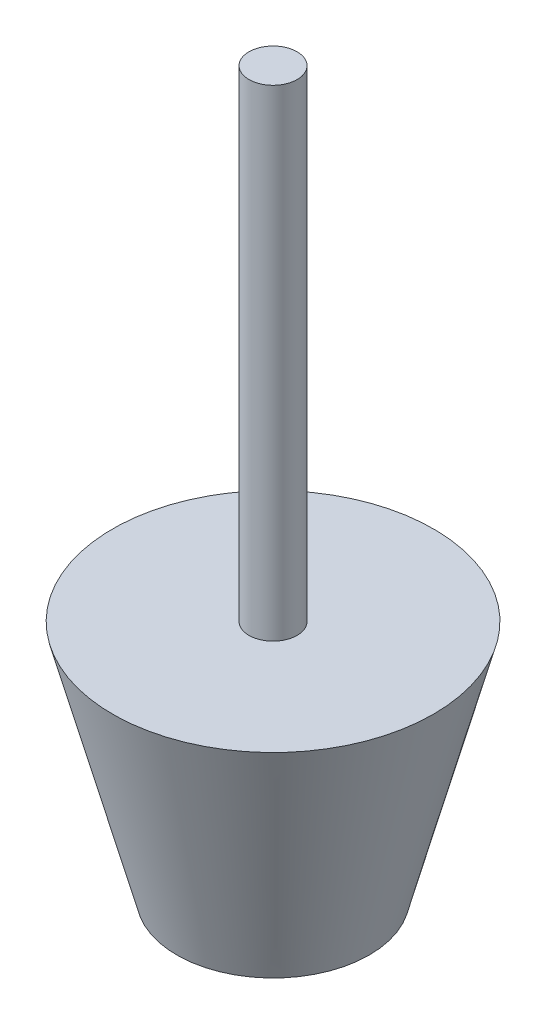
ISO-10303-21;
HEADER;
FILE_DESCRIPTION(('STEP AP214'),'2;1');
FILE_NAME('part.step','',(''),(''),'','','');
FILE_SCHEMA(('AUTOMOTIVE_DESIGN { 1 0 10303 214 1 1 1 1 }'));
ENDSEC;
DATA;
#1=APPLICATION_CONTEXT('core data for automotive mechanical design processes');
#2=APPLICATION_PROTOCOL_DEFINITION('international standard','automotive_design',2000,#1);
#3=PRODUCT_CONTEXT('',#1,'mechanical');
#4=PRODUCT('Part','Part','',(#3));
#5=PRODUCT_RELATED_PRODUCT_CATEGORY('part','',(#4));
#6=PRODUCT_DEFINITION_FORMATION('','',#4);
#7=PRODUCT_DEFINITION_CONTEXT('part definition',#1,'design');
#8=PRODUCT_DEFINITION('design','',#6,#7);
#9=PRODUCT_DEFINITION_SHAPE('','',#8);
#10=(LENGTH_UNIT() NAMED_UNIT(*) SI_UNIT(.MILLI.,.METRE.));
#11=(NAMED_UNIT(*) PLANE_ANGLE_UNIT() SI_UNIT($,.RADIAN.));
#12=(NAMED_UNIT(*) SI_UNIT($,.STERADIAN.) SOLID_ANGLE_UNIT());
#13=UNCERTAINTY_MEASURE_WITH_UNIT(LENGTH_MEASURE(1.E-05),#10,'distance_accuracy_value','');
#14=(GEOMETRIC_REPRESENTATION_CONTEXT(3) GLOBAL_UNCERTAINTY_ASSIGNED_CONTEXT((#13)) GLOBAL_UNIT_ASSIGNED_CONTEXT((#10,
#11,#12)) REPRESENTATION_CONTEXT('',''));
#15=CARTESIAN_POINT('',(0.,0.,0.));
#16=DIRECTION('',(0.,0.,1.));
#17=DIRECTION('',(1.,0.,0.));
#18=AXIS2_PLACEMENT_3D('',#15,#16,#17);
#19=CARTESIAN_POINT('',(0.,-30.,0.));
#20=DIRECTION('',(0.,-1.,0.));
#21=DIRECTION('',(1.,0.,0.));
#22=AXIS2_PLACEMENT_3D('',#19,#20,#21);
#23=CYLINDRICAL_SURFACE('',#22,1.5);
#24=CARTESIAN_POINT('',(0.,-15.,0.));
#25=DIRECTION('',(0.,-1.,0.));
#26=DIRECTION('',(1.,0.,0.));
#27=AXIS2_PLACEMENT_3D('',#24,#25,#26);
#28=CIRCLE('',#27,1.5);
#29=CARTESIAN_POINT('',(1.5,-15.,0.));
#30=VERTEX_POINT('',#29);
#31=EDGE_CURVE('E45',#30,#30,#28,.T.);
#32=ORIENTED_EDGE('',*,*,#31,.F.);
#33=EDGE_LOOP('',(#32));
#34=FACE_BOUND('',#33,.T.);
#35=CARTESIAN_POINT('',(0.,15.,0.));
#36=DIRECTION('',(0.,-1.,0.));
#37=DIRECTION('',(1.,0.,0.));
#38=AXIS2_PLACEMENT_3D('',#35,#36,#37);
#39=CIRCLE('',#38,1.50000000000001);
#40=CARTESIAN_POINT('',(1.50000000000001,15.,0.));
#41=VERTEX_POINT('',#40);
#42=EDGE_CURVE('E10',#41,#41,#39,.T.);
#43=ORIENTED_EDGE('',*,*,#42,.T.);
#44=EDGE_LOOP('',(#43));
#45=FACE_BOUND('',#44,.T.);
#46=ADVANCED_FACE('F31',(#34,#45),#23,.T.);
#47=CARTESIAN_POINT('',(-1.5,15.,0.));
#48=DIRECTION('',(0.,-1.,0.));
#49=DIRECTION('',(1.,0.,0.));
#50=AXIS2_PLACEMENT_3D('',#47,#48,#49);
#51=PLANE('',#50);
#52=ORIENTED_EDGE('',*,*,#42,.F.);
#53=EDGE_LOOP('',(#52));
#54=FACE_BOUND('',#53,.T.);
#55=ADVANCED_FACE('F54',(#54),#51,.F.);
#56=CARTESIAN_POINT('',(-6.,-30.,0.));
#57=DIRECTION('',(0.,1.,0.));
#58=DIRECTION('',(-1.,0.,0.));
#59=AXIS2_PLACEMENT_3D('',#56,#57,#58);
#60=PLANE('',#59);
#61=CARTESIAN_POINT('',(0.,-30.,0.));
#62=DIRECTION('',(0.,-1.,0.));
#63=DIRECTION('',(1.,0.,0.));
#64=AXIS2_PLACEMENT_3D('',#61,#62,#63);
#65=CIRCLE('',#64,6.);
#66=CARTESIAN_POINT('',(6.,-30.,0.));
#67=VERTEX_POINT('',#66);
#68=EDGE_CURVE('E37',#67,#67,#65,.T.);
#69=ORIENTED_EDGE('',*,*,#68,.T.);
#70=EDGE_LOOP('',(#69));
#71=FACE_BOUND('',#70,.T.);
#72=ADVANCED_FACE('F58',(#71),#60,.F.);
#73=CARTESIAN_POINT('',(0.,-15.,0.));
#74=DIRECTION('',(0.,1.,0.));
#75=DIRECTION('',(-1.,0.,0.));
#76=AXIS2_PLACEMENT_3D('',#73,#74,#75);
#77=CONICAL_SURFACE('',#76,10.,0.260602391747341);
#78=ORIENTED_EDGE('',*,*,#68,.F.);
#79=EDGE_LOOP('',(#78));
#80=FACE_BOUND('',#79,.T.);
#81=CARTESIAN_POINT('',(0.,-15.,0.));
#82=DIRECTION('',(0.,-1.,0.));
#83=DIRECTION('',(1.,0.,0.));
#84=AXIS2_PLACEMENT_3D('',#81,#82,#83);
#85=CIRCLE('',#84,10.);
#86=CARTESIAN_POINT('',(10.,-15.,0.));
#87=VERTEX_POINT('',#86);
#88=EDGE_CURVE('E41',#87,#87,#85,.T.);
#89=ORIENTED_EDGE('',*,*,#88,.T.);
#90=EDGE_LOOP('',(#89));
#91=FACE_BOUND('',#90,.T.);
#92=ADVANCED_FACE('F63',(#80,#91),#77,.T.);
#93=CARTESIAN_POINT('',(-1.5,-15.,0.));
#94=DIRECTION('',(0.,-1.,0.));
#95=DIRECTION('',(1.,0.,0.));
#96=AXIS2_PLACEMENT_3D('',#93,#94,#95);
#97=PLANE('',#96);
#98=ORIENTED_EDGE('',*,*,#88,.F.);
#99=EDGE_LOOP('',(#98));
#100=FACE_BOUND('',#99,.T.);
#101=ORIENTED_EDGE('',*,*,#31,.T.);
#102=EDGE_LOOP('',(#101));
#103=FACE_BOUND('',#102,.T.);
#104=ADVANCED_FACE('F51',(#100,#103),#97,.F.);
#105=CLOSED_SHELL('',(#46,#55,#72,#92,#104));
#106=MANIFOLD_SOLID_BREP('B2',#105);
#107=ADVANCED_BREP_SHAPE_REPRESENTATION('',(#18,#106),#14);
#108=SHAPE_DEFINITION_REPRESENTATION(#9,#107);
ENDSEC;
END-ISO-10303-21;
